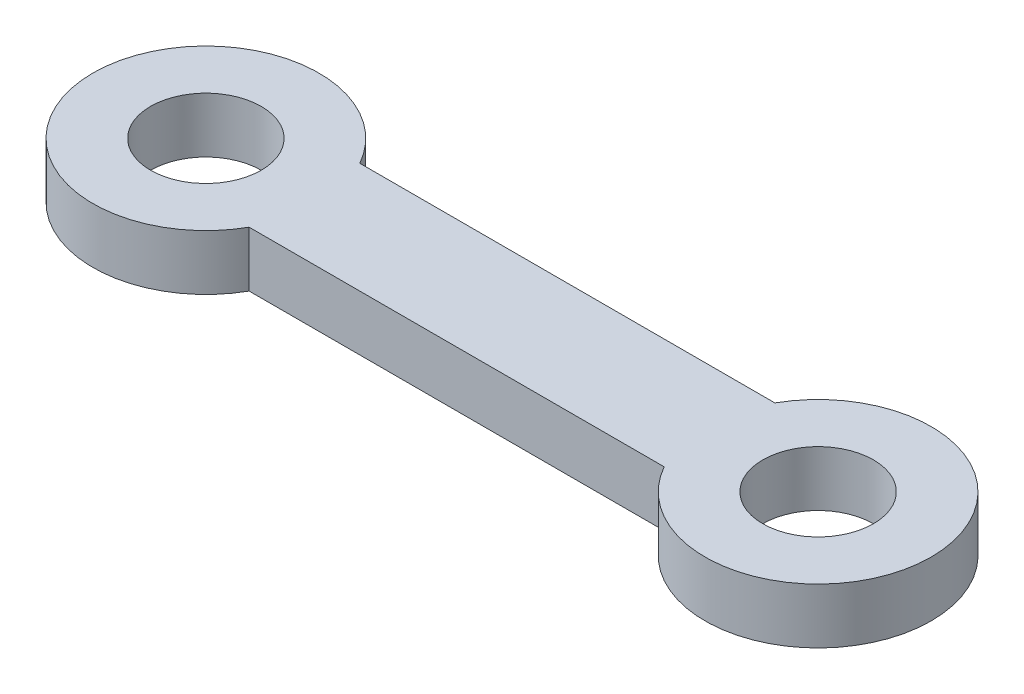
ISO-10303-21;
HEADER;
FILE_DESCRIPTION(('STEP AP214'),'2;1');
FILE_NAME('part.step','',(''),(''),'','','');
FILE_SCHEMA(('AUTOMOTIVE_DESIGN { 1 0 10303 214 1 1 1 1 }'));
ENDSEC;
DATA;
#1=APPLICATION_CONTEXT('core data for automotive mechanical design processes');
#2=APPLICATION_PROTOCOL_DEFINITION('international standard','automotive_design',2000,#1);
#3=PRODUCT_CONTEXT('',#1,'mechanical');
#4=PRODUCT('Part','Part','',(#3));
#5=PRODUCT_RELATED_PRODUCT_CATEGORY('part','',(#4));
#6=PRODUCT_DEFINITION_FORMATION('','',#4);
#7=PRODUCT_DEFINITION_CONTEXT('part definition',#1,'design');
#8=PRODUCT_DEFINITION('design','',#6,#7);
#9=PRODUCT_DEFINITION_SHAPE('','',#8);
#10=(LENGTH_UNIT() NAMED_UNIT(*) SI_UNIT(.MILLI.,.METRE.));
#11=(NAMED_UNIT(*) PLANE_ANGLE_UNIT() SI_UNIT($,.RADIAN.));
#12=(NAMED_UNIT(*) SI_UNIT($,.STERADIAN.) SOLID_ANGLE_UNIT());
#13=UNCERTAINTY_MEASURE_WITH_UNIT(LENGTH_MEASURE(1.E-05),#10,'distance_accuracy_value','');
#14=(GEOMETRIC_REPRESENTATION_CONTEXT(3) GLOBAL_UNCERTAINTY_ASSIGNED_CONTEXT((#13)) GLOBAL_UNIT_ASSIGNED_CONTEXT((#10,
#11,#12)) REPRESENTATION_CONTEXT('',''));
#15=CARTESIAN_POINT('',(0.,0.,0.));
#16=DIRECTION('',(0.,0.,1.));
#17=DIRECTION('',(1.,0.,0.));
#18=AXIS2_PLACEMENT_3D('',#15,#16,#17);
#19=CARTESIAN_POINT('',(110.634204652227,20.,0.));
#20=DIRECTION('',(0.,-1.,0.));
#21=DIRECTION('',(0.,0.,-1.));
#22=AXIS2_PLACEMENT_3D('',#19,#20,#21);
#23=CYLINDRICAL_SURFACE('',#22,40.8631440444422);
#24=CARTESIAN_POINT('',(110.634204652227,0.,0.));
#25=DIRECTION('',(0.,1.,0.));
#26=DIRECTION('',(0.,0.,1.));
#27=AXIS2_PLACEMENT_3D('',#24,#25,#26);
#28=CIRCLE('',#27,40.8631440444422);
#29=CARTESIAN_POINT('',(75.,0.,-20.));
#30=VERTEX_POINT('',#29);
#31=CARTESIAN_POINT('',(75.,0.,20.));
#32=VERTEX_POINT('',#31);
#33=EDGE_CURVE('E100',#30,#32,#28,.F.);
#34=ORIENTED_EDGE('',*,*,#33,.F.);
#35=DIRECTION('',(0.,-1.,0.));
#36=VECTOR('',#35,1.);
#37=CARTESIAN_POINT('',(75.,20.,-20.));
#38=LINE('',#37,#36);
#39=CARTESIAN_POINT('',(75.,20.,-20.));
#40=VERTEX_POINT('',#39);
#41=EDGE_CURVE('E60',#40,#30,#38,.T.);
#42=ORIENTED_EDGE('',*,*,#41,.F.);
#43=CARTESIAN_POINT('',(110.634204652227,20.,0.));
#44=DIRECTION('',(0.,1.,0.));
#45=DIRECTION('',(0.,0.,1.));
#46=AXIS2_PLACEMENT_3D('',#43,#44,#45);
#47=CIRCLE('',#46,40.8631440444422);
#48=CARTESIAN_POINT('',(75.,20.,20.));
#49=VERTEX_POINT('',#48);
#50=EDGE_CURVE('E98',#40,#49,#47,.F.);
#51=ORIENTED_EDGE('',*,*,#50,.T.);
#52=DIRECTION('',(0.,-1.,0.));
#53=VECTOR('',#52,1.);
#54=CARTESIAN_POINT('',(75.,20.,20.));
#55=LINE('',#54,#53);
#56=EDGE_CURVE('E12',#49,#32,#55,.T.);
#57=ORIENTED_EDGE('',*,*,#56,.T.);
#58=EDGE_LOOP('',(#34,#42,#51,#57));
#59=FACE_BOUND('',#58,.T.);
#60=ADVANCED_FACE('F50',(#59),#23,.T.);
#61=CARTESIAN_POINT('',(0.,20.,-20.));
#62=DIRECTION('',(0.,0.,-1.));
#63=DIRECTION('',(-1.,0.,0.));
#64=AXIS2_PLACEMENT_3D('',#61,#62,#63);
#65=PLANE('',#64);
#66=DIRECTION('',(1.,0.,0.));
#67=VECTOR('',#66,1.);
#68=CARTESIAN_POINT('',(0.,0.,-20.));
#69=LINE('',#68,#67);
#70=CARTESIAN_POINT('',(-75.,0.,-20.));
#71=VERTEX_POINT('',#70);
#72=EDGE_CURVE('E119',#71,#30,#69,.T.);
#73=ORIENTED_EDGE('',*,*,#72,.F.);
#74=DIRECTION('',(0.,-1.,0.));
#75=VECTOR('',#74,1.);
#76=CARTESIAN_POINT('',(-75.,20.,-20.));
#77=LINE('',#76,#75);
#78=CARTESIAN_POINT('',(-75.,20.,-20.));
#79=VERTEX_POINT('',#78);
#80=EDGE_CURVE('E82',#79,#71,#77,.T.);
#81=ORIENTED_EDGE('',*,*,#80,.F.);
#82=DIRECTION('',(1.,0.,0.));
#83=VECTOR('',#82,1.);
#84=CARTESIAN_POINT('',(0.,20.,-20.));
#85=LINE('',#84,#83);
#86=EDGE_CURVE('E108',#79,#40,#85,.T.);
#87=ORIENTED_EDGE('',*,*,#86,.T.);
#88=ORIENTED_EDGE('',*,*,#41,.T.);
#89=EDGE_LOOP('',(#73,#81,#87,#88));
#90=FACE_BOUND('',#89,.T.);
#91=ADVANCED_FACE('F110',(#90),#65,.T.);
#92=CARTESIAN_POINT('',(0.,20.,20.));
#93=DIRECTION('',(0.,0.,-1.));
#94=DIRECTION('',(-1.,0.,0.));
#95=AXIS2_PLACEMENT_3D('',#92,#93,#94);
#96=PLANE('',#95);
#97=DIRECTION('',(1.,0.,0.));
#98=VECTOR('',#97,1.);
#99=CARTESIAN_POINT('',(0.,0.,20.));
#100=LINE('',#99,#98);
#101=CARTESIAN_POINT('',(-75.,0.,20.));
#102=VERTEX_POINT('',#101);
#103=EDGE_CURVE('E115',#102,#32,#100,.T.);
#104=ORIENTED_EDGE('',*,*,#103,.T.);
#105=ORIENTED_EDGE('',*,*,#56,.F.);
#106=DIRECTION('',(1.,0.,0.));
#107=VECTOR('',#106,1.);
#108=CARTESIAN_POINT('',(0.,20.,20.));
#109=LINE('',#108,#107);
#110=CARTESIAN_POINT('',(-75.,20.,20.));
#111=VERTEX_POINT('',#110);
#112=EDGE_CURVE('E92',#111,#49,#109,.T.);
#113=ORIENTED_EDGE('',*,*,#112,.F.);
#114=DIRECTION('',(0.,-1.,0.));
#115=VECTOR('',#114,1.);
#116=CARTESIAN_POINT('',(-75.,20.,20.));
#117=LINE('',#116,#115);
#118=EDGE_CURVE('E69',#111,#102,#117,.T.);
#119=ORIENTED_EDGE('',*,*,#118,.T.);
#120=EDGE_LOOP('',(#104,#105,#113,#119));
#121=FACE_BOUND('',#120,.T.);
#122=ADVANCED_FACE('F143',(#121),#96,.F.);
#123=CARTESIAN_POINT('',(0.,0.,0.));
#124=DIRECTION('',(0.,1.,0.));
#125=DIRECTION('',(0.,0.,1.));
#126=AXIS2_PLACEMENT_3D('',#123,#124,#125);
#127=PLANE('',#126);
#128=CARTESIAN_POINT('',(110.634204652227,0.,0.));
#129=DIRECTION('',(0.,-1.,0.));
#130=DIRECTION('',(0.,0.,-1.));
#131=AXIS2_PLACEMENT_3D('',#128,#129,#130);
#132=CIRCLE('',#131,20.);
#133=CARTESIAN_POINT('',(110.634204652227,0.,-20.));
#134=VERTEX_POINT('',#133);
#135=EDGE_CURVE('E121',#134,#134,#132,.T.);
#136=ORIENTED_EDGE('',*,*,#135,.F.);
#137=EDGE_LOOP('',(#136));
#138=FACE_BOUND('',#137,.T.);
#139=CARTESIAN_POINT('',(-110.634204652227,0.,0.));
#140=DIRECTION('',(0.,-1.,0.));
#141=DIRECTION('',(0.,0.,-1.));
#142=AXIS2_PLACEMENT_3D('',#139,#140,#141);
#143=CIRCLE('',#142,20.);
#144=CARTESIAN_POINT('',(-110.634204652227,0.,-20.));
#145=VERTEX_POINT('',#144);
#146=EDGE_CURVE('E134',#145,#145,#143,.T.);
#147=ORIENTED_EDGE('',*,*,#146,.F.);
#148=EDGE_LOOP('',(#147));
#149=FACE_BOUND('',#148,.T.);
#150=ORIENTED_EDGE('',*,*,#103,.F.);
#151=CARTESIAN_POINT('',(-110.634204652227,0.,0.));
#152=DIRECTION('',(0.,1.,0.));
#153=DIRECTION('',(0.,0.,1.));
#154=AXIS2_PLACEMENT_3D('',#151,#152,#153);
#155=CIRCLE('',#154,40.8631440444422);
#156=EDGE_CURVE('E54',#71,#102,#155,.T.);
#157=ORIENTED_EDGE('',*,*,#156,.F.);
#158=ORIENTED_EDGE('',*,*,#72,.T.);
#159=ORIENTED_EDGE('',*,*,#33,.T.);
#160=EDGE_LOOP('',(#150,#157,#158,#159));
#161=FACE_BOUND('',#160,.T.);
#162=ADVANCED_FACE('F140',(#138,#149,#161),#127,.F.);
#163=CARTESIAN_POINT('',(0.,20.,0.));
#164=DIRECTION('',(0.,1.,0.));
#165=DIRECTION('',(0.,0.,1.));
#166=AXIS2_PLACEMENT_3D('',#163,#164,#165);
#167=PLANE('',#166);
#168=CARTESIAN_POINT('',(110.634204652227,20.,0.));
#169=DIRECTION('',(0.,1.,0.));
#170=DIRECTION('',(0.,0.,1.));
#171=AXIS2_PLACEMENT_3D('',#168,#169,#170);
#172=CIRCLE('',#171,20.);
#173=CARTESIAN_POINT('',(110.634204652227,20.,20.));
#174=VERTEX_POINT('',#173);
#175=EDGE_CURVE('E124',#174,#174,#172,.F.);
#176=ORIENTED_EDGE('',*,*,#175,.T.);
#177=EDGE_LOOP('',(#176));
#178=FACE_BOUND('',#177,.T.);
#179=CARTESIAN_POINT('',(-110.634204652227,20.,0.));
#180=DIRECTION('',(0.,1.,0.));
#181=DIRECTION('',(0.,0.,1.));
#182=AXIS2_PLACEMENT_3D('',#179,#180,#181);
#183=CIRCLE('',#182,20.);
#184=CARTESIAN_POINT('',(-110.634204652227,20.,20.));
#185=VERTEX_POINT('',#184);
#186=EDGE_CURVE('E129',#185,#185,#183,.F.);
#187=ORIENTED_EDGE('',*,*,#186,.T.);
#188=EDGE_LOOP('',(#187));
#189=FACE_BOUND('',#188,.T.);
#190=ORIENTED_EDGE('',*,*,#112,.T.);
#191=ORIENTED_EDGE('',*,*,#50,.F.);
#192=ORIENTED_EDGE('',*,*,#86,.F.);
#193=CARTESIAN_POINT('',(-110.634204652227,20.,0.));
#194=DIRECTION('',(0.,1.,0.));
#195=DIRECTION('',(0.,0.,1.));
#196=AXIS2_PLACEMENT_3D('',#193,#194,#195);
#197=CIRCLE('',#196,40.8631440444422);
#198=EDGE_CURVE('E117',#79,#111,#197,.T.);
#199=ORIENTED_EDGE('',*,*,#198,.T.);
#200=EDGE_LOOP('',(#190,#191,#192,#199));
#201=FACE_BOUND('',#200,.T.);
#202=ADVANCED_FACE('F107',(#178,#189,#201),#167,.T.);
#203=CARTESIAN_POINT('',(-110.634204652227,20.,0.));
#204=DIRECTION('',(0.,-1.,0.));
#205=DIRECTION('',(0.,0.,-1.));
#206=AXIS2_PLACEMENT_3D('',#203,#204,#205);
#207=CYLINDRICAL_SURFACE('',#206,40.8631440444422);
#208=ORIENTED_EDGE('',*,*,#156,.T.);
#209=ORIENTED_EDGE('',*,*,#118,.F.);
#210=ORIENTED_EDGE('',*,*,#198,.F.);
#211=ORIENTED_EDGE('',*,*,#80,.T.);
#212=EDGE_LOOP('',(#208,#209,#210,#211));
#213=FACE_BOUND('',#212,.T.);
#214=ADVANCED_FACE('F52',(#213),#207,.T.);
#215=CARTESIAN_POINT('',(-110.634204652227,20.001,0.));
#216=DIRECTION('',(0.,-1.,0.));
#217=DIRECTION('',(0.,0.,-1.));
#218=AXIS2_PLACEMENT_3D('',#215,#216,#217);
#219=CYLINDRICAL_SURFACE('',#218,20.);
#220=ORIENTED_EDGE('',*,*,#186,.F.);
#221=EDGE_LOOP('',(#220));
#222=FACE_BOUND('',#221,.T.);
#223=ORIENTED_EDGE('',*,*,#146,.T.);
#224=EDGE_LOOP('',(#223));
#225=FACE_BOUND('',#224,.T.);
#226=ADVANCED_FACE('F138',(#222,#225),#219,.F.);
#227=CARTESIAN_POINT('',(110.634204652227,20.001,0.));
#228=DIRECTION('',(0.,-1.,0.));
#229=DIRECTION('',(0.,0.,-1.));
#230=AXIS2_PLACEMENT_3D('',#227,#228,#229);
#231=CYLINDRICAL_SURFACE('',#230,20.);
#232=ORIENTED_EDGE('',*,*,#175,.F.);
#233=EDGE_LOOP('',(#232));
#234=FACE_BOUND('',#233,.T.);
#235=ORIENTED_EDGE('',*,*,#135,.T.);
#236=EDGE_LOOP('',(#235));
#237=FACE_BOUND('',#236,.T.);
#238=ADVANCED_FACE('F161',(#234,#237),#231,.F.);
#239=CLOSED_SHELL('',(#60,#91,#122,#162,#202,#214,#226,#238));
#240=MANIFOLD_SOLID_BREP('B2',#239);
#241=ADVANCED_BREP_SHAPE_REPRESENTATION('',(#18,#240),#14);
#242=SHAPE_DEFINITION_REPRESENTATION(#9,#241);
ENDSEC;
END-ISO-10303-21;
